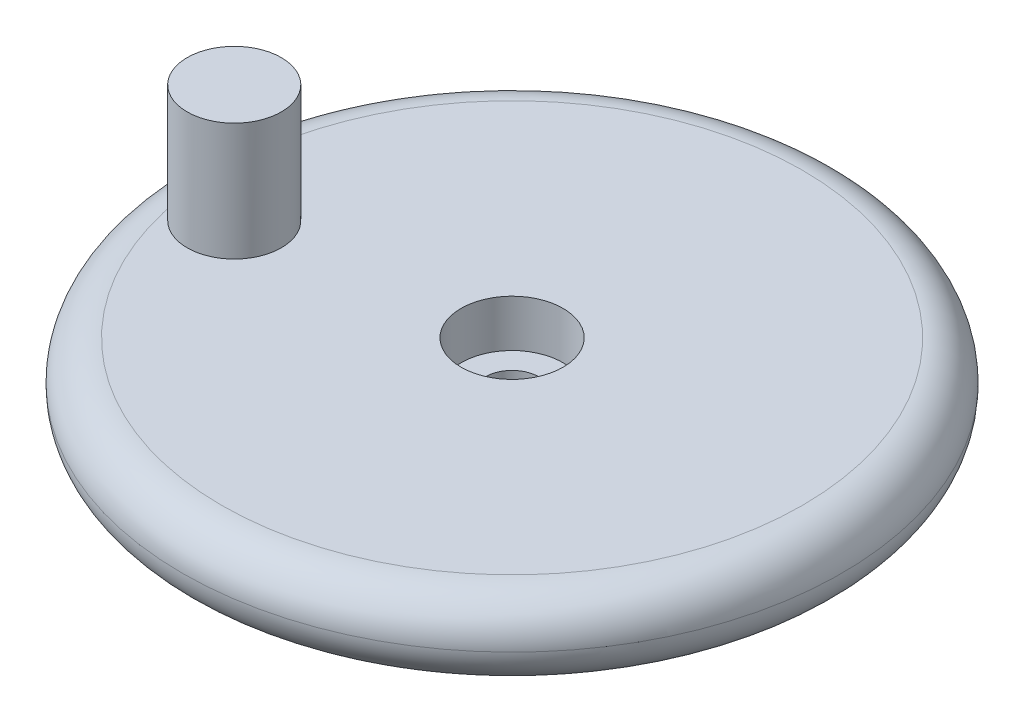
ISO-10303-21;
HEADER;
FILE_DESCRIPTION(('STEP AP214'),'2;1');
FILE_NAME('part.step','',(''),(''),'','','');
FILE_SCHEMA(('AUTOMOTIVE_DESIGN { 1 0 10303 214 1 1 1 1 }'));
ENDSEC;
DATA;
#1=APPLICATION_CONTEXT('core data for automotive mechanical design processes');
#2=APPLICATION_PROTOCOL_DEFINITION('international standard','automotive_design',2000,#1);
#3=PRODUCT_CONTEXT('',#1,'mechanical');
#4=PRODUCT('Part','Part','',(#3));
#5=PRODUCT_RELATED_PRODUCT_CATEGORY('part','',(#4));
#6=PRODUCT_DEFINITION_FORMATION('','',#4);
#7=PRODUCT_DEFINITION_CONTEXT('part definition',#1,'design');
#8=PRODUCT_DEFINITION('design','',#6,#7);
#9=PRODUCT_DEFINITION_SHAPE('','',#8);
#10=(LENGTH_UNIT() NAMED_UNIT(*) SI_UNIT(.MILLI.,.METRE.));
#11=(NAMED_UNIT(*) PLANE_ANGLE_UNIT() SI_UNIT($,.RADIAN.));
#12=(NAMED_UNIT(*) SI_UNIT($,.STERADIAN.) SOLID_ANGLE_UNIT());
#13=UNCERTAINTY_MEASURE_WITH_UNIT(LENGTH_MEASURE(1.E-05),#10,'distance_accuracy_value','');
#14=(GEOMETRIC_REPRESENTATION_CONTEXT(3) GLOBAL_UNCERTAINTY_ASSIGNED_CONTEXT((#13)) GLOBAL_UNIT_ASSIGNED_CONTEXT((#10,
#11,#12)) REPRESENTATION_CONTEXT('',''));
#15=CARTESIAN_POINT('',(0.,0.,0.));
#16=DIRECTION('',(0.,0.,1.));
#17=DIRECTION('',(1.,0.,0.));
#18=AXIS2_PLACEMENT_3D('',#15,#16,#17);
#19=CARTESIAN_POINT('',(0.,5.,0.));
#20=DIRECTION('',(0.,1.,0.));
#21=DIRECTION('',(0.,0.,1.));
#22=AXIS2_PLACEMENT_3D('',#19,#20,#21);
#23=PLANE('',#22);
#24=CARTESIAN_POINT('',(0.,5.,0.));
#25=DIRECTION('',(0.,1.,0.));
#26=DIRECTION('',(0.,0.,1.));
#27=AXIS2_PLACEMENT_3D('',#24,#25,#26);
#28=CIRCLE('',#27,3.25);
#29=CARTESIAN_POINT('',(0.,5.,3.25));
#30=VERTEX_POINT('',#29);
#31=EDGE_CURVE('E122',#30,#30,#28,.T.);
#32=ORIENTED_EDGE('',*,*,#31,.F.);
#33=EDGE_LOOP('',(#32));
#34=FACE_BOUND('',#33,.T.);
#35=CARTESIAN_POINT('',(0.,5.,0.));
#36=DIRECTION('',(0.,1.,0.));
#37=DIRECTION('',(0.,0.,1.));
#38=AXIS2_PLACEMENT_3D('',#35,#36,#37);
#39=CIRCLE('',#38,18.5);
#40=CARTESIAN_POINT('',(-18.2791507469028,5.,2.85002595988233));
#41=VERTEX_POINT('',#40);
#42=EDGE_CURVE('E13',#41,#41,#39,.T.);
#43=ORIENTED_EDGE('',*,*,#42,.T.);
#44=CARTESIAN_POINT('',(-15.3149641392969,5.,2.38785958800952));
#45=DIRECTION('',(0.,1.,0.));
#46=DIRECTION('',(0.,0.,1.));
#47=AXIS2_PLACEMENT_3D('',#44,#45,#46);
#48=CIRCLE('',#47,3.);
#49=EDGE_CURVE('E59',#41,#41,#48,.T.);
#50=ORIENTED_EDGE('',*,*,#49,.F.);
#51=EDGE_LOOP('',(#43,#50));
#52=FACE_BOUND('',#51,.T.);
#53=ADVANCED_FACE('F47',(#34,#52),#23,.T.);
#54=CARTESIAN_POINT('',(0.,0.,0.));
#55=DIRECTION('',(0.,1.,0.));
#56=DIRECTION('',(0.,0.,1.));
#57=AXIS2_PLACEMENT_3D('',#54,#55,#56);
#58=PLANE('',#57);
#59=CARTESIAN_POINT('',(0.,0.,0.));
#60=DIRECTION('',(0.,1.,0.));
#61=DIRECTION('',(0.,0.,1.));
#62=AXIS2_PLACEMENT_3D('',#59,#60,#61);
#63=CIRCLE('',#62,1.7);
#64=CARTESIAN_POINT('',(0.,0.,1.7));
#65=VERTEX_POINT('',#64);
#66=EDGE_CURVE('E63',#65,#65,#63,.T.);
#67=ORIENTED_EDGE('',*,*,#66,.T.);
#68=EDGE_LOOP('',(#67));
#69=FACE_BOUND('',#68,.T.);
#70=CARTESIAN_POINT('',(0.,0.,0.));
#71=DIRECTION('',(0.,1.,0.));
#72=DIRECTION('',(0.,0.,1.));
#73=AXIS2_PLACEMENT_3D('',#70,#71,#72);
#74=CIRCLE('',#73,18.5);
#75=CARTESIAN_POINT('',(0.,0.,18.5));
#76=VERTEX_POINT('',#75);
#77=EDGE_CURVE('E55',#76,#76,#74,.F.);
#78=ORIENTED_EDGE('',*,*,#77,.T.);
#79=EDGE_LOOP('',(#78));
#80=FACE_BOUND('',#79,.T.);
#81=ADVANCED_FACE('F80',(#69,#80),#58,.F.);
#82=CARTESIAN_POINT('',(0.,2.5,0.));
#83=DIRECTION('',(0.,1.,0.));
#84=DIRECTION('',(0.,0.,1.));
#85=AXIS2_PLACEMENT_3D('',#82,#83,#84);
#86=TOROIDAL_SURFACE('',#85,18.5,2.5);
#87=ORIENTED_EDGE('',*,*,#42,.F.);
#88=EDGE_LOOP('',(#87));
#89=FACE_BOUND('',#88,.T.);
#90=CARTESIAN_POINT('',(0.,2.5,0.));
#91=DIRECTION('',(0.,1.,0.));
#92=DIRECTION('',(0.,0.,1.));
#93=AXIS2_PLACEMENT_3D('',#90,#91,#92);
#94=CIRCLE('',#93,21.);
#95=CARTESIAN_POINT('',(0.,2.5,21.));
#96=VERTEX_POINT('',#95);
#97=EDGE_CURVE('E51',#96,#96,#94,.F.);
#98=ORIENTED_EDGE('',*,*,#97,.F.);
#99=EDGE_LOOP('',(#98));
#100=FACE_BOUND('',#99,.T.);
#101=ADVANCED_FACE('F49',(#89,#100),#86,.T.);
#102=CARTESIAN_POINT('',(0.,2.5,0.));
#103=DIRECTION('',(0.,1.,0.));
#104=DIRECTION('',(0.,0.,1.));
#105=AXIS2_PLACEMENT_3D('',#102,#103,#104);
#106=TOROIDAL_SURFACE('',#105,18.5,2.5);
#107=ORIENTED_EDGE('',*,*,#77,.F.);
#108=EDGE_LOOP('',(#107));
#109=FACE_BOUND('',#108,.T.);
#110=ORIENTED_EDGE('',*,*,#97,.T.);
#111=EDGE_LOOP('',(#110));
#112=FACE_BOUND('',#111,.T.);
#113=ADVANCED_FACE('F77',(#109,#112),#106,.T.);
#114=CARTESIAN_POINT('',(-15.3149641392969,12.5,2.38785958800952));
#115=DIRECTION('',(0.,-1.,0.));
#116=DIRECTION('',(0.,0.,-1.));
#117=AXIS2_PLACEMENT_3D('',#114,#115,#116);
#118=CYLINDRICAL_SURFACE('',#117,3.);
#119=CARTESIAN_POINT('',(-15.3149641392969,12.5,2.38785958800952));
#120=DIRECTION('',(0.,1.,0.));
#121=DIRECTION('',(0.,0.,1.));
#122=AXIS2_PLACEMENT_3D('',#119,#120,#121);
#123=CIRCLE('',#122,3.);
#124=CARTESIAN_POINT('',(-15.3149641392969,12.5,5.38785958800952));
#125=VERTEX_POINT('',#124);
#126=EDGE_CURVE('E62',#125,#125,#123,.T.);
#127=ORIENTED_EDGE('',*,*,#126,.F.);
#128=EDGE_LOOP('',(#127));
#129=FACE_BOUND('',#128,.T.);
#130=ORIENTED_EDGE('',*,*,#49,.T.);
#131=EDGE_LOOP('',(#130));
#132=FACE_BOUND('',#131,.T.);
#133=ADVANCED_FACE('F60',(#129,#132),#118,.T.);
#134=CARTESIAN_POINT('',(-15.3149641392969,12.5,2.38785958800952));
#135=DIRECTION('',(0.,1.,0.));
#136=DIRECTION('',(0.,0.,1.));
#137=AXIS2_PLACEMENT_3D('',#134,#135,#136);
#138=PLANE('',#137);
#139=ORIENTED_EDGE('',*,*,#126,.T.);
#140=EDGE_LOOP('',(#139));
#141=FACE_BOUND('',#140,.T.);
#142=ADVANCED_FACE('F99',(#141),#138,.T.);
#143=CARTESIAN_POINT('',(0.,5.,0.));
#144=DIRECTION('',(0.,1.,0.));
#145=DIRECTION('',(0.,0.,1.));
#146=AXIS2_PLACEMENT_3D('',#143,#144,#145);
#147=CYLINDRICAL_SURFACE('',#146,1.7);
#148=ORIENTED_EDGE('',*,*,#66,.F.);
#149=EDGE_LOOP('',(#148));
#150=FACE_BOUND('',#149,.T.);
#151=CARTESIAN_POINT('',(0.,2.,0.));
#152=DIRECTION('',(0.,1.,0.));
#153=DIRECTION('',(0.,0.,1.));
#154=AXIS2_PLACEMENT_3D('',#151,#152,#153);
#155=CIRCLE('',#154,1.7);
#156=CARTESIAN_POINT('',(0.,2.,1.7));
#157=VERTEX_POINT('',#156);
#158=EDGE_CURVE('E68',#157,#157,#155,.T.);
#159=ORIENTED_EDGE('',*,*,#158,.T.);
#160=EDGE_LOOP('',(#159));
#161=FACE_BOUND('',#160,.T.);
#162=ADVANCED_FACE('F103',(#150,#161),#147,.F.);
#163=CARTESIAN_POINT('',(1.7,2.,0.));
#164=DIRECTION('',(0.,-1.,0.));
#165=DIRECTION('',(0.,0.,-1.));
#166=AXIS2_PLACEMENT_3D('',#163,#164,#165);
#167=PLANE('',#166);
#168=ORIENTED_EDGE('',*,*,#158,.F.);
#169=EDGE_LOOP('',(#168));
#170=FACE_BOUND('',#169,.T.);
#171=CARTESIAN_POINT('',(0.,2.,0.));
#172=DIRECTION('',(0.,1.,0.));
#173=DIRECTION('',(0.,0.,1.));
#174=AXIS2_PLACEMENT_3D('',#171,#172,#173);
#175=CIRCLE('',#174,3.25);
#176=CARTESIAN_POINT('',(0.,2.,3.25));
#177=VERTEX_POINT('',#176);
#178=EDGE_CURVE('E120',#177,#177,#175,.T.);
#179=ORIENTED_EDGE('',*,*,#178,.T.);
#180=EDGE_LOOP('',(#179));
#181=FACE_BOUND('',#180,.T.);
#182=ADVANCED_FACE('F107',(#170,#181),#167,.F.);
#183=CARTESIAN_POINT('',(0.,5.,0.));
#184=DIRECTION('',(0.,1.,0.));
#185=DIRECTION('',(0.,0.,1.));
#186=AXIS2_PLACEMENT_3D('',#183,#184,#185);
#187=CYLINDRICAL_SURFACE('',#186,3.25);
#188=ORIENTED_EDGE('',*,*,#178,.F.);
#189=EDGE_LOOP('',(#188));
#190=FACE_BOUND('',#189,.T.);
#191=ORIENTED_EDGE('',*,*,#31,.T.);
#192=EDGE_LOOP('',(#191));
#193=FACE_BOUND('',#192,.T.);
#194=ADVANCED_FACE('F111',(#190,#193),#187,.F.);
#195=CLOSED_SHELL('',(#53,#81,#101,#113,#133,#142,#162,#182,#194));
#196=MANIFOLD_SOLID_BREP('B2',#195);
#197=ADVANCED_BREP_SHAPE_REPRESENTATION('',(#18,#196),#14);
#198=SHAPE_DEFINITION_REPRESENTATION(#9,#197);
ENDSEC;
END-ISO-10303-21;
